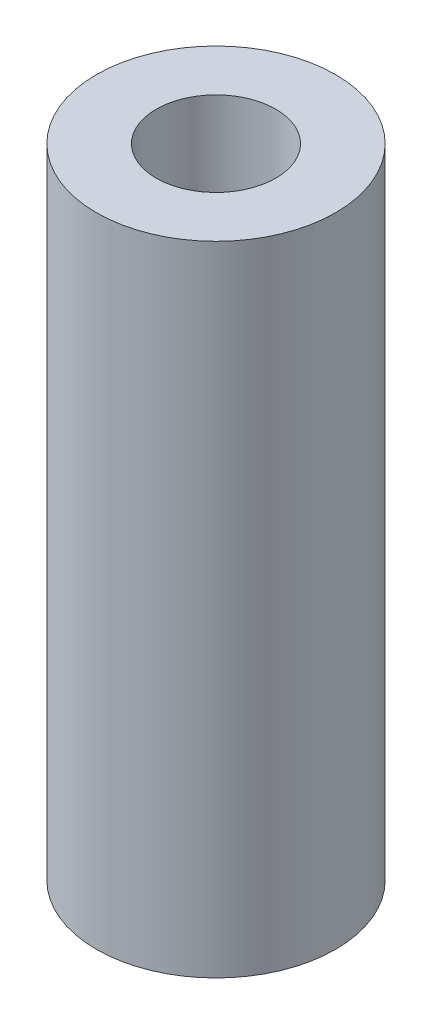
ISO-10303-21;
HEADER;
FILE_DESCRIPTION(('STEP AP214'),'2;1');
FILE_NAME('part.step','',(''),(''),'','','');
FILE_SCHEMA(('AUTOMOTIVE_DESIGN { 1 0 10303 214 1 1 1 1 }'));
ENDSEC;
DATA;
#1=APPLICATION_CONTEXT('core data for automotive mechanical design processes');
#2=APPLICATION_PROTOCOL_DEFINITION('international standard','automotive_design',2000,#1);
#3=PRODUCT_CONTEXT('',#1,'mechanical');
#4=PRODUCT('Part','Part','',(#3));
#5=PRODUCT_RELATED_PRODUCT_CATEGORY('part','',(#4));
#6=PRODUCT_DEFINITION_FORMATION('','',#4);
#7=PRODUCT_DEFINITION_CONTEXT('part definition',#1,'design');
#8=PRODUCT_DEFINITION('design','',#6,#7);
#9=PRODUCT_DEFINITION_SHAPE('','',#8);
#10=(LENGTH_UNIT() NAMED_UNIT(*) SI_UNIT(.MILLI.,.METRE.));
#11=(NAMED_UNIT(*) PLANE_ANGLE_UNIT() SI_UNIT($,.RADIAN.));
#12=(NAMED_UNIT(*) SI_UNIT($,.STERADIAN.) SOLID_ANGLE_UNIT());
#13=UNCERTAINTY_MEASURE_WITH_UNIT(LENGTH_MEASURE(1.E-05),#10,'distance_accuracy_value','');
#14=(GEOMETRIC_REPRESENTATION_CONTEXT(3) GLOBAL_UNCERTAINTY_ASSIGNED_CONTEXT((#13)) GLOBAL_UNIT_ASSIGNED_CONTEXT((#10,
#11,#12)) REPRESENTATION_CONTEXT('',''));
#15=CARTESIAN_POINT('',(0.,0.,0.));
#16=DIRECTION('',(0.,0.,1.));
#17=DIRECTION('',(1.,0.,0.));
#18=AXIS2_PLACEMENT_3D('',#15,#16,#17);
#19=CARTESIAN_POINT('',(0.,16.,0.));
#20=DIRECTION('',(0.,1.,0.));
#21=DIRECTION('',(0.,0.,1.));
#22=AXIS2_PLACEMENT_3D('',#19,#20,#21);
#23=PLANE('',#22);
#24=CARTESIAN_POINT('',(0.,16.,0.));
#25=DIRECTION('',(0.,1.,0.));
#26=DIRECTION('',(0.,0.,1.));
#27=AXIS2_PLACEMENT_3D('',#24,#25,#26);
#28=CIRCLE('',#27,3.);
#29=CARTESIAN_POINT('',(0.,16.,3.));
#30=VERTEX_POINT('',#29);
#31=EDGE_CURVE('E10',#30,#30,#28,.T.);
#32=ORIENTED_EDGE('',*,*,#31,.T.);
#33=EDGE_LOOP('',(#32));
#34=FACE_BOUND('',#33,.T.);
#35=CARTESIAN_POINT('',(0.,16.,0.));
#36=DIRECTION('',(0.,1.,0.));
#37=DIRECTION('',(0.,0.,1.));
#38=AXIS2_PLACEMENT_3D('',#35,#36,#37);
#39=CIRCLE('',#38,1.5);
#40=CARTESIAN_POINT('',(0.,16.,1.5));
#41=VERTEX_POINT('',#40);
#42=EDGE_CURVE('E45',#41,#41,#39,.T.);
#43=ORIENTED_EDGE('',*,*,#42,.F.);
#44=EDGE_LOOP('',(#43));
#45=FACE_BOUND('',#44,.T.);
#46=ADVANCED_FACE('F34',(#34,#45),#23,.T.);
#47=CARTESIAN_POINT('',(0.,0.,0.));
#48=DIRECTION('',(0.,1.,0.));
#49=DIRECTION('',(0.,0.,1.));
#50=AXIS2_PLACEMENT_3D('',#47,#48,#49);
#51=PLANE('',#50);
#52=CARTESIAN_POINT('',(0.,0.,0.));
#53=DIRECTION('',(0.,1.,0.));
#54=DIRECTION('',(0.,0.,1.));
#55=AXIS2_PLACEMENT_3D('',#52,#53,#54);
#56=CIRCLE('',#55,3.);
#57=CARTESIAN_POINT('',(0.,0.,3.));
#58=VERTEX_POINT('',#57);
#59=EDGE_CURVE('E38',#58,#58,#56,.T.);
#60=ORIENTED_EDGE('',*,*,#59,.F.);
#61=EDGE_LOOP('',(#60));
#62=FACE_BOUND('',#61,.T.);
#63=CARTESIAN_POINT('',(0.,0.,0.));
#64=DIRECTION('',(0.,1.,0.));
#65=DIRECTION('',(0.,0.,1.));
#66=AXIS2_PLACEMENT_3D('',#63,#64,#65);
#67=CIRCLE('',#66,1.5);
#68=CARTESIAN_POINT('',(0.,0.,1.5));
#69=VERTEX_POINT('',#68);
#70=EDGE_CURVE('E47',#69,#69,#67,.T.);
#71=ORIENTED_EDGE('',*,*,#70,.T.);
#72=EDGE_LOOP('',(#71));
#73=FACE_BOUND('',#72,.T.);
#74=ADVANCED_FACE('F57',(#62,#73),#51,.F.);
#75=CARTESIAN_POINT('',(0.,16.,0.));
#76=DIRECTION('',(0.,-1.,0.));
#77=DIRECTION('',(0.,0.,-1.));
#78=AXIS2_PLACEMENT_3D('',#75,#76,#77);
#79=CYLINDRICAL_SURFACE('',#78,3.);
#80=ORIENTED_EDGE('',*,*,#31,.F.);
#81=EDGE_LOOP('',(#80));
#82=FACE_BOUND('',#81,.T.);
#83=ORIENTED_EDGE('',*,*,#59,.T.);
#84=EDGE_LOOP('',(#83));
#85=FACE_BOUND('',#84,.T.);
#86=ADVANCED_FACE('F36',(#82,#85),#79,.T.);
#87=CARTESIAN_POINT('',(0.,16.,0.));
#88=DIRECTION('',(0.,-1.,0.));
#89=DIRECTION('',(0.,0.,-1.));
#90=AXIS2_PLACEMENT_3D('',#87,#88,#89);
#91=CYLINDRICAL_SURFACE('',#90,1.5);
#92=ORIENTED_EDGE('',*,*,#42,.T.);
#93=EDGE_LOOP('',(#92));
#94=FACE_BOUND('',#93,.T.);
#95=ORIENTED_EDGE('',*,*,#70,.F.);
#96=EDGE_LOOP('',(#95));
#97=FACE_BOUND('',#96,.T.);
#98=ADVANCED_FACE('F53',(#94,#97),#91,.F.);
#99=CLOSED_SHELL('',(#46,#74,#86,#98));
#100=MANIFOLD_SOLID_BREP('B2',#99);
#101=ADVANCED_BREP_SHAPE_REPRESENTATION('',(#18,#100),#14);
#102=SHAPE_DEFINITION_REPRESENTATION(#9,#101);
ENDSEC;
END-ISO-10303-21;
